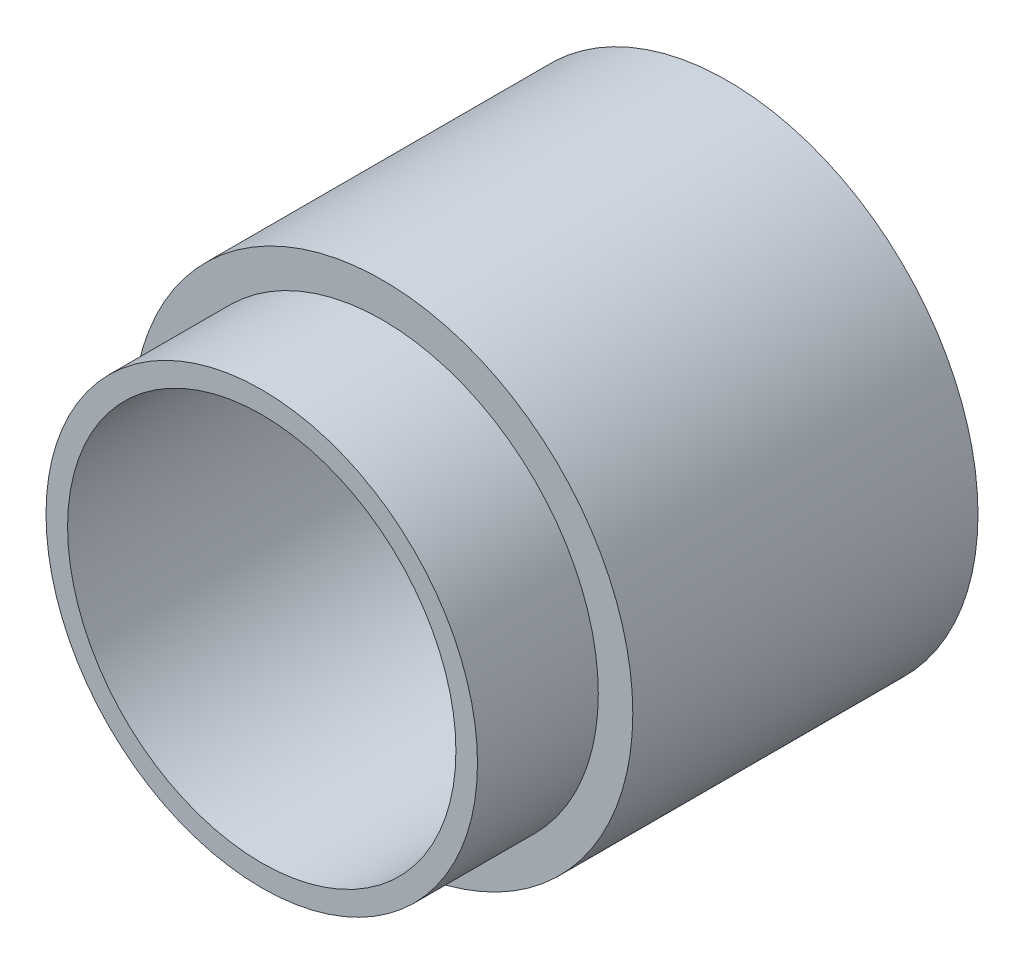
ISO-10303-21;
HEADER;
FILE_DESCRIPTION(('STEP AP214'),'2;1');
FILE_NAME('part.step','',(''),(''),'','','');
FILE_SCHEMA(('AUTOMOTIVE_DESIGN { 1 0 10303 214 1 1 1 1 }'));
ENDSEC;
DATA;
#1=APPLICATION_CONTEXT('core data for automotive mechanical design processes');
#2=APPLICATION_PROTOCOL_DEFINITION('international standard','automotive_design',2000,#1);
#3=PRODUCT_CONTEXT('',#1,'mechanical');
#4=PRODUCT('Part','Part','',(#3));
#5=PRODUCT_RELATED_PRODUCT_CATEGORY('part','',(#4));
#6=PRODUCT_DEFINITION_FORMATION('','',#4);
#7=PRODUCT_DEFINITION_CONTEXT('part definition',#1,'design');
#8=PRODUCT_DEFINITION('design','',#6,#7);
#9=PRODUCT_DEFINITION_SHAPE('','',#8);
#10=(LENGTH_UNIT() NAMED_UNIT(*) SI_UNIT(.MILLI.,.METRE.));
#11=(NAMED_UNIT(*) PLANE_ANGLE_UNIT() SI_UNIT($,.RADIAN.));
#12=(NAMED_UNIT(*) SI_UNIT($,.STERADIAN.) SOLID_ANGLE_UNIT());
#13=UNCERTAINTY_MEASURE_WITH_UNIT(LENGTH_MEASURE(1.E-05),#10,'distance_accuracy_value','');
#14=(GEOMETRIC_REPRESENTATION_CONTEXT(3) GLOBAL_UNCERTAINTY_ASSIGNED_CONTEXT((#13)) GLOBAL_UNIT_ASSIGNED_CONTEXT((#10,
#11,#12)) REPRESENTATION_CONTEXT('',''));
#15=CARTESIAN_POINT('',(0.,0.,0.));
#16=DIRECTION('',(0.,0.,1.));
#17=DIRECTION('',(1.,0.,0.));
#18=AXIS2_PLACEMENT_3D('',#15,#16,#17);
#19=CARTESIAN_POINT('',(0.,0.,13.5));
#20=DIRECTION('',(0.,0.,-1.));
#21=DIRECTION('',(-1.,0.,0.));
#22=AXIS2_PLACEMENT_3D('',#19,#20,#21);
#23=CYLINDRICAL_SURFACE('',#22,14.5);
#24=CARTESIAN_POINT('',(0.,0.,-13.5));
#25=DIRECTION('',(0.,0.,1.));
#26=DIRECTION('',(1.,0.,0.));
#27=AXIS2_PLACEMENT_3D('',#24,#25,#26);
#28=CIRCLE('',#27,14.5);
#29=CARTESIAN_POINT('',(14.5,0.,-13.5));
#30=VERTEX_POINT('',#29);
#31=EDGE_CURVE('E11',#30,#30,#28,.T.);
#32=ORIENTED_EDGE('',*,*,#31,.T.);
#33=EDGE_LOOP('',(#32));
#34=FACE_BOUND('',#33,.T.);
#35=CARTESIAN_POINT('',(0.,0.,6.5));
#36=DIRECTION('',(0.,0.,1.));
#37=DIRECTION('',(1.,0.,0.));
#38=AXIS2_PLACEMENT_3D('',#35,#36,#37);
#39=CIRCLE('',#38,14.5);
#40=CARTESIAN_POINT('',(14.5,0.,6.5));
#41=VERTEX_POINT('',#40);
#42=EDGE_CURVE('E35',#41,#41,#39,.T.);
#43=ORIENTED_EDGE('',*,*,#42,.F.);
#44=EDGE_LOOP('',(#43));
#45=FACE_BOUND('',#44,.T.);
#46=ADVANCED_FACE('F32',(#34,#45),#23,.T.);
#47=CARTESIAN_POINT('',(0.,0.,-13.5));
#48=DIRECTION('',(0.,0.,1.));
#49=DIRECTION('',(1.,0.,0.));
#50=AXIS2_PLACEMENT_3D('',#47,#48,#49);
#51=PLANE('',#50);
#52=CARTESIAN_POINT('',(0.,0.,-13.5));
#53=DIRECTION('',(0.,0.,1.));
#54=DIRECTION('',(1.,0.,0.));
#55=AXIS2_PLACEMENT_3D('',#52,#53,#54);
#56=CIRCLE('',#55,11.25);
#57=CARTESIAN_POINT('',(11.25,0.,-13.5));
#58=VERTEX_POINT('',#57);
#59=EDGE_CURVE('E47',#58,#58,#56,.T.);
#60=ORIENTED_EDGE('',*,*,#59,.T.);
#61=EDGE_LOOP('',(#60));
#62=FACE_BOUND('',#61,.T.);
#63=ORIENTED_EDGE('',*,*,#31,.F.);
#64=EDGE_LOOP('',(#63));
#65=FACE_BOUND('',#64,.T.);
#66=ADVANCED_FACE('F56',(#62,#65),#51,.F.);
#67=CARTESIAN_POINT('',(0.,0.,6.5));
#68=DIRECTION('',(0.,0.,1.));
#69=DIRECTION('',(1.,0.,0.));
#70=AXIS2_PLACEMENT_3D('',#67,#68,#69);
#71=PLANE('',#70);
#72=CARTESIAN_POINT('',(0.,0.,6.5));
#73=DIRECTION('',(0.,0.,1.));
#74=DIRECTION('',(1.,0.,0.));
#75=AXIS2_PLACEMENT_3D('',#72,#73,#74);
#76=CIRCLE('',#75,12.5);
#77=CARTESIAN_POINT('',(12.5,0.,6.5));
#78=VERTEX_POINT('',#77);
#79=EDGE_CURVE('E42',#78,#78,#76,.T.);
#80=ORIENTED_EDGE('',*,*,#79,.F.);
#81=EDGE_LOOP('',(#80));
#82=FACE_BOUND('',#81,.T.);
#83=ORIENTED_EDGE('',*,*,#42,.T.);
#84=EDGE_LOOP('',(#83));
#85=FACE_BOUND('',#84,.T.);
#86=ADVANCED_FACE('F73',(#82,#85),#71,.T.);
#87=CARTESIAN_POINT('',(0.,0.,6.5));
#88=DIRECTION('',(0.,0.,1.));
#89=DIRECTION('',(1.,0.,0.));
#90=AXIS2_PLACEMENT_3D('',#87,#88,#89);
#91=CYLINDRICAL_SURFACE('',#90,12.5);
#92=ORIENTED_EDGE('',*,*,#79,.T.);
#93=EDGE_LOOP('',(#92));
#94=FACE_BOUND('',#93,.T.);
#95=CARTESIAN_POINT('',(0.,0.,13.5));
#96=DIRECTION('',(0.,0.,1.));
#97=DIRECTION('',(1.,0.,0.));
#98=AXIS2_PLACEMENT_3D('',#95,#96,#97);
#99=CIRCLE('',#98,12.5);
#100=CARTESIAN_POINT('',(12.5,0.,13.5));
#101=VERTEX_POINT('',#100);
#102=EDGE_CURVE('E44',#101,#101,#99,.T.);
#103=ORIENTED_EDGE('',*,*,#102,.F.);
#104=EDGE_LOOP('',(#103));
#105=FACE_BOUND('',#104,.T.);
#106=ADVANCED_FACE('F68',(#94,#105),#91,.T.);
#107=CARTESIAN_POINT('',(0.,0.,13.5));
#108=DIRECTION('',(0.,0.,1.));
#109=DIRECTION('',(1.,0.,0.));
#110=AXIS2_PLACEMENT_3D('',#107,#108,#109);
#111=PLANE('',#110);
#112=CARTESIAN_POINT('',(0.,0.,13.5));
#113=DIRECTION('',(0.,0.,1.));
#114=DIRECTION('',(1.,0.,0.));
#115=AXIS2_PLACEMENT_3D('',#112,#113,#114);
#116=CIRCLE('',#115,11.25);
#117=CARTESIAN_POINT('',(11.25,0.,13.5));
#118=VERTEX_POINT('',#117);
#119=EDGE_CURVE('E50',#118,#118,#116,.T.);
#120=ORIENTED_EDGE('',*,*,#119,.F.);
#121=EDGE_LOOP('',(#120));
#122=FACE_BOUND('',#121,.T.);
#123=ORIENTED_EDGE('',*,*,#102,.T.);
#124=EDGE_LOOP('',(#123));
#125=FACE_BOUND('',#124,.T.);
#126=ADVANCED_FACE('F62',(#122,#125),#111,.T.);
#127=CARTESIAN_POINT('',(0.,0.,-13.5));
#128=DIRECTION('',(0.,0.,1.));
#129=DIRECTION('',(1.,0.,0.));
#130=AXIS2_PLACEMENT_3D('',#127,#128,#129);
#131=CYLINDRICAL_SURFACE('',#130,11.25);
#132=ORIENTED_EDGE('',*,*,#59,.F.);
#133=EDGE_LOOP('',(#132));
#134=FACE_BOUND('',#133,.T.);
#135=ORIENTED_EDGE('',*,*,#119,.T.);
#136=EDGE_LOOP('',(#135));
#137=FACE_BOUND('',#136,.T.);
#138=ADVANCED_FACE('F59',(#134,#137),#131,.F.);
#139=CLOSED_SHELL('',(#46,#66,#86,#106,#126,#138));
#140=MANIFOLD_SOLID_BREP('B2',#139);
#141=ADVANCED_BREP_SHAPE_REPRESENTATION('',(#18,#140),#14);
#142=SHAPE_DEFINITION_REPRESENTATION(#9,#141);
ENDSEC;
END-ISO-10303-21;
